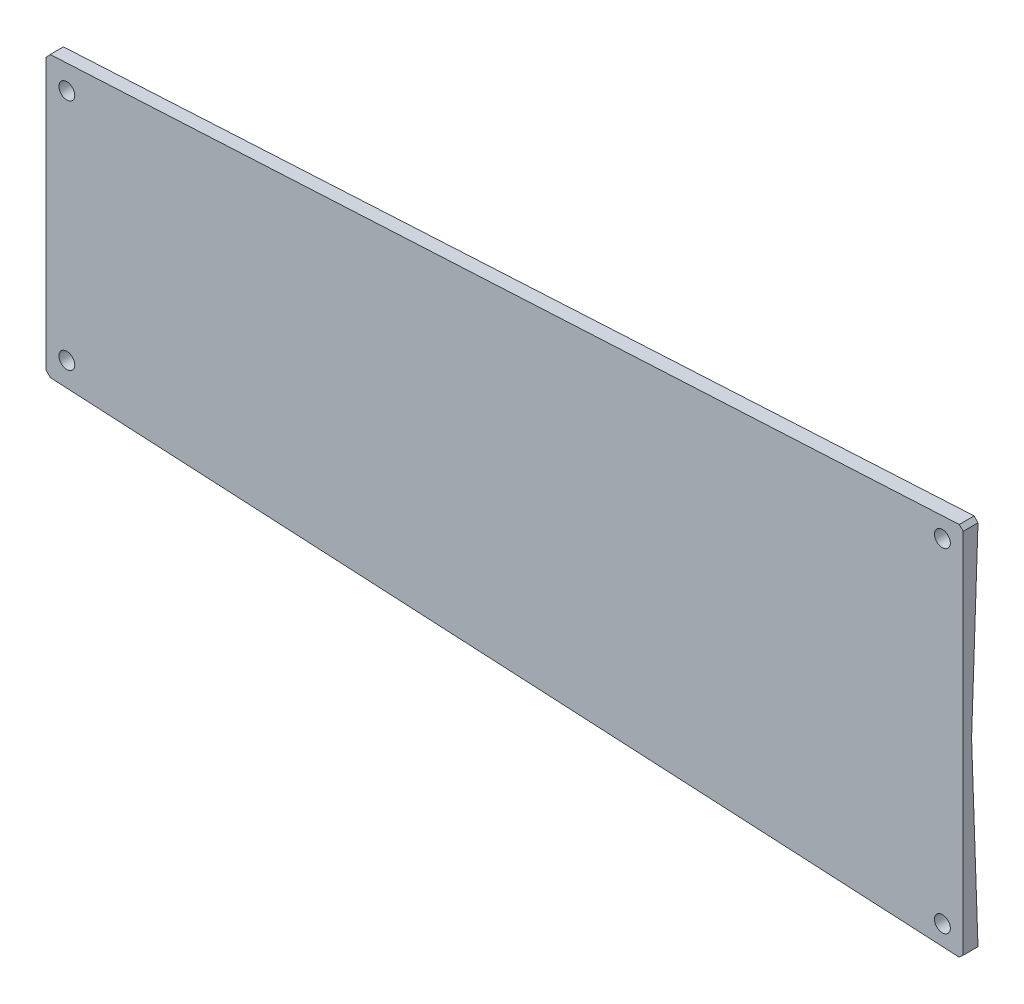
ISO-10303-21;
HEADER;
FILE_DESCRIPTION(('STEP AP214'),'2;1');
FILE_NAME('part.step','',(''),(''),'','','');
FILE_SCHEMA(('AUTOMOTIVE_DESIGN { 1 0 10303 214 1 1 1 1 }'));
ENDSEC;
DATA;
#1=APPLICATION_CONTEXT('core data for automotive mechanical design processes');
#2=APPLICATION_PROTOCOL_DEFINITION('international standard','automotive_design',2000,#1);
#3=PRODUCT_CONTEXT('',#1,'mechanical');
#4=PRODUCT('Part','Part','',(#3));
#5=PRODUCT_RELATED_PRODUCT_CATEGORY('part','',(#4));
#6=PRODUCT_DEFINITION_FORMATION('','',#4);
#7=PRODUCT_DEFINITION_CONTEXT('part definition',#1,'design');
#8=PRODUCT_DEFINITION('design','',#6,#7);
#9=PRODUCT_DEFINITION_SHAPE('','',#8);
#10=(LENGTH_UNIT() NAMED_UNIT(*) SI_UNIT(.MILLI.,.METRE.));
#11=(NAMED_UNIT(*) PLANE_ANGLE_UNIT() SI_UNIT($,.RADIAN.));
#12=(NAMED_UNIT(*) SI_UNIT($,.STERADIAN.) SOLID_ANGLE_UNIT());
#13=UNCERTAINTY_MEASURE_WITH_UNIT(LENGTH_MEASURE(1.E-05),#10,'distance_accuracy_value','');
#14=(GEOMETRIC_REPRESENTATION_CONTEXT(3) GLOBAL_UNCERTAINTY_ASSIGNED_CONTEXT((#13)) GLOBAL_UNIT_ASSIGNED_CONTEXT((#10,
#11,#12)) REPRESENTATION_CONTEXT('',''));
#15=CARTESIAN_POINT('',(0.,0.,0.));
#16=DIRECTION('',(0.,0.,1.));
#17=DIRECTION('',(1.,0.,0.));
#18=AXIS2_PLACEMENT_3D('',#15,#16,#17);
#19=CARTESIAN_POINT('',(32.8928091397849,0.,2.));
#20=DIRECTION('',(0.,0.,-1.));
#21=DIRECTION('',(-1.,0.,0.));
#22=AXIS2_PLACEMENT_3D('',#19,#20,#21);
#23=PLANE('',#22);
#24=CARTESIAN_POINT('',(-182.107190860215,28.,2.));
#25=DIRECTION('',(0.,0.,1.));
#26=DIRECTION('',(1.,0.,0.));
#27=AXIS2_PLACEMENT_3D('',#24,#25,#26);
#28=CIRCLE('',#27,1.9);
#29=CARTESIAN_POINT('',(-180.207190860215,28.,2.));
#30=VERTEX_POINT('',#29);
#31=EDGE_CURVE('E154',#30,#30,#28,.T.);
#32=ORIENTED_EDGE('',*,*,#31,.F.);
#33=EDGE_LOOP('',(#32));
#34=FACE_BOUND('',#33,.T.);
#35=DIRECTION('',(0.,1.,0.));
#36=VECTOR('',#35,1.);
#37=CARTESIAN_POINT('',(32.8928091397849,0.,2.));
#38=LINE('',#37,#36);
#39=CARTESIAN_POINT('',(32.8928091397849,-44.0483785609465,2.));
#40=VERTEX_POINT('',#39);
#41=CARTESIAN_POINT('',(32.8928091397849,44.,2.));
#42=VERTEX_POINT('',#41);
#43=EDGE_CURVE('E126',#40,#42,#38,.T.);
#44=ORIENTED_EDGE('',*,*,#43,.T.);
#45=DIRECTION('',(0.707106781186535,-0.70710678118656,0.));
#46=VECTOR('',#45,1.);
#47=CARTESIAN_POINT('',(31.9424851657029,44.9503239740821,2.));
#48=LINE('',#47,#46);
#49=CARTESIAN_POINT('',(31.9424851657029,44.9503239740821,2.));
#50=VERTEX_POINT('',#49);
#51=EDGE_CURVE('E11',#42,#50,#48,.F.);
#52=ORIENTED_EDGE('',*,*,#51,.T.);
#53=DIRECTION('',(-0.998636574463203,-0.0522014573014856,0.));
#54=VECTOR('',#53,1.);
#55=CARTESIAN_POINT('',(32.8928091397849,45.,2.));
#56=LINE('',#55,#54);
#57=CARTESIAN_POINT('',(-186.108554285752,33.5522014573015,2.));
#58=VERTEX_POINT('',#57);
#59=EDGE_CURVE('E158',#50,#58,#56,.T.);
#60=ORIENTED_EDGE('',*,*,#59,.T.);
#61=DIRECTION('',(0.669230689298131,0.74305469818954,0.));
#62=VECTOR('',#61,1.);
#63=CARTESIAN_POINT('',(-187.107190860215,32.4434035340965,2.));
#64=LINE('',#63,#62);
#65=CARTESIAN_POINT('',(-187.107190860215,32.4434035340965,2.));
#66=VERTEX_POINT('',#65);
#67=EDGE_CURVE('E175',#58,#66,#64,.F.);
#68=ORIENTED_EDGE('',*,*,#67,.T.);
#69=DIRECTION('',(0.,-1.,0.));
#70=VECTOR('',#69,1.);
#71=CARTESIAN_POINT('',(-187.107190860215,33.5,2.));
#72=LINE('',#71,#70);
#73=CARTESIAN_POINT('',(-187.107190860215,-32.5,2.));
#74=VERTEX_POINT('',#73);
#75=EDGE_CURVE('E160',#66,#74,#72,.T.);
#76=ORIENTED_EDGE('',*,*,#75,.T.);
#77=DIRECTION('',(-0.707106781186545,0.70710678118655,0.));
#78=VECTOR('',#77,1.);
#79=CARTESIAN_POINT('',(-186.052034984915,-33.5551558752998,2.));
#80=LINE('',#79,#78);
#81=CARTESIAN_POINT('',(-186.052034984915,-33.5551558752998,2.));
#82=VERTEX_POINT('',#81);
#83=EDGE_CURVE('E183',#74,#82,#80,.F.);
#84=ORIENTED_EDGE('',*,*,#83,.T.);
#85=DIRECTION('',(-0.998636574463203,0.0522014573014856,0.));
#86=VECTOR('',#85,1.);
#87=CARTESIAN_POINT('',(32.8928091397849,-45.,2.));
#88=LINE('',#87,#86);
#89=CARTESIAN_POINT('',(31.8941725653217,-44.9477985426985,2.));
#90=VERTEX_POINT('',#89);
#91=EDGE_CURVE('E115',#90,#82,#88,.T.);
#92=ORIENTED_EDGE('',*,*,#91,.F.);
#93=DIRECTION('',(-0.743054698189538,-0.669230689298133,0.));
#94=VECTOR('',#93,1.);
#95=CARTESIAN_POINT('',(32.8928091397849,-44.0483785609465,2.));
#96=LINE('',#95,#94);
#97=EDGE_CURVE('E193',#90,#40,#96,.F.);
#98=ORIENTED_EDGE('',*,*,#97,.T.);
#99=EDGE_LOOP('',(#44,#52,#60,#68,#76,#84,#92,#98));
#100=FACE_BOUND('',#99,.T.);
#101=CARTESIAN_POINT('',(27.892809139785,40.,2.));
#102=DIRECTION('',(0.,0.,1.));
#103=DIRECTION('',(1.,0.,0.));
#104=AXIS2_PLACEMENT_3D('',#101,#102,#103);
#105=CIRCLE('',#104,1.9);
#106=CARTESIAN_POINT('',(29.792809139785,40.,2.));
#107=VERTEX_POINT('',#106);
#108=EDGE_CURVE('E149',#107,#107,#105,.T.);
#109=ORIENTED_EDGE('',*,*,#108,.F.);
#110=EDGE_LOOP('',(#109));
#111=FACE_BOUND('',#110,.T.);
#112=CARTESIAN_POINT('',(-182.107190860215,-28.,2.));
#113=DIRECTION('',(0.,0.,-1.));
#114=DIRECTION('',(1.,0.,0.));
#115=AXIS2_PLACEMENT_3D('',#112,#113,#114);
#116=CIRCLE('',#115,1.9);
#117=CARTESIAN_POINT('',(-180.207190860215,-28.,2.));
#118=VERTEX_POINT('',#117);
#119=EDGE_CURVE('E134',#118,#118,#116,.T.);
#120=ORIENTED_EDGE('',*,*,#119,.T.);
#121=EDGE_LOOP('',(#120));
#122=FACE_BOUND('',#121,.T.);
#123=CARTESIAN_POINT('',(27.892809139785,-40.,2.));
#124=DIRECTION('',(0.,0.,-1.));
#125=DIRECTION('',(1.,0.,0.));
#126=AXIS2_PLACEMENT_3D('',#123,#124,#125);
#127=CIRCLE('',#126,1.9);
#128=CARTESIAN_POINT('',(29.792809139785,-40.,2.));
#129=VERTEX_POINT('',#128);
#130=EDGE_CURVE('E143',#129,#129,#127,.T.);
#131=ORIENTED_EDGE('',*,*,#130,.T.);
#132=EDGE_LOOP('',(#131));
#133=FACE_BOUND('',#132,.T.);
#134=ADVANCED_FACE('F34',(#34,#100,#111,#122,#133),#23,.F.);
#135=CARTESIAN_POINT('',(32.8928091397849,0.,0.));
#136=DIRECTION('',(0.,-0.034899496702501,-0.999390827019096));
#137=DIRECTION('',(0.,0.999390827019096,-0.034899496702501));
#138=AXIS2_PLACEMENT_3D('',#135,#136,#137);
#139=PLANE('',#138);
#140=CARTESIAN_POINT('',(-182.107190860215,28.,-0.977781545768939));
#141=DIRECTION('',(0.,-0.034899496702501,-0.999390827019096));
#142=DIRECTION('',(0.,0.999390827019096,-0.034899496702501));
#143=AXIS2_PLACEMENT_3D('',#140,#141,#142);
#144=ELLIPSE('',#143,1.90115813416776,1.9);
#145=CARTESIAN_POINT('',(-182.107190860215,29.9,-1.04413100780326));
#146=VERTEX_POINT('',#145);
#147=EDGE_CURVE('E152',#146,#146,#144,.F.);
#148=ORIENTED_EDGE('',*,*,#147,.T.);
#149=EDGE_LOOP('',(#148));
#150=FACE_BOUND('',#149,.T.);
#151=DIRECTION('',(-0.99863491522303,-0.0522013705684766,0.00182291202877508));
#152=VECTOR('',#151,1.);
#153=CARTESIAN_POINT('',(30.544093455857,44.8772262256129,-1.56714727245365));
#154=LINE('',#153,#152);
#155=CARTESIAN_POINT('',(31.9424851657029,44.9503239740821,-1.56969990207831));
#156=VERTEX_POINT('',#155);
#157=CARTESIAN_POINT('',(-186.108554285752,33.5522014573015,-1.17166869303111));
#158=VERTEX_POINT('',#157);
#159=EDGE_CURVE('E127',#156,#158,#154,.T.);
#160=ORIENTED_EDGE('',*,*,#159,.F.);
#161=DIRECTION('',(-0.706891307583151,0.706891307583177,-0.0246851884078323));
#162=VECTOR('',#161,1.);
#163=CARTESIAN_POINT('',(54.906215027373,21.9865941124111,-0.767788784908129));
#164=LINE('',#163,#162);
#165=CARTESIAN_POINT('',(32.8928091397849,44.,-1.5365138576369));
#166=VERTEX_POINT('',#165);
#167=EDGE_CURVE('E56',#156,#166,#164,.F.);
#168=ORIENTED_EDGE('',*,*,#167,.T.);
#169=DIRECTION('',(0.,0.999390827019096,-0.034899496702501));
#170=VECTOR('',#169,1.);
#171=CARTESIAN_POINT('',(32.8928091397849,0.,0.));
#172=LINE('',#171,#170);
#173=CARTESIAN_POINT('',(32.8928091397849,0.,0.));
#174=VERTEX_POINT('',#173);
#175=EDGE_CURVE('E131',#174,#166,#172,.T.);
#176=ORIENTED_EDGE('',*,*,#175,.F.);
#177=DIRECTION('',(1.,0.,0.));
#178=VECTOR('',#177,1.);
#179=CARTESIAN_POINT('',(32.8928091397849,0.,0.));
#180=LINE('',#179,#178);
#181=CARTESIAN_POINT('',(-187.107190860215,0.,0.));
#182=VERTEX_POINT('',#181);
#183=EDGE_CURVE('E110',#182,#174,#180,.T.);
#184=ORIENTED_EDGE('',*,*,#183,.F.);
#185=DIRECTION('',(0.,-0.999390827019096,0.034899496702501));
#186=VECTOR('',#185,1.);
#187=CARTESIAN_POINT('',(-187.107190860215,0.,0.));
#188=LINE('',#187,#186);
#189=CARTESIAN_POINT('',(-187.107190860215,32.4434035340964,-1.13294861634194));
#190=VERTEX_POINT('',#189);
#191=EDGE_CURVE('E120',#190,#182,#188,.T.);
#192=ORIENTED_EDGE('',*,*,#191,.F.);
#193=DIRECTION('',(-0.669005506199368,-0.742804674748946,0.0259393108243007));
#194=VECTOR('',#193,1.);
#195=CARTESIAN_POINT('',(-104.784249215167,123.847532986513,-4.32485115154364));
#196=LINE('',#195,#194);
#197=EDGE_CURVE('E170',#190,#158,#196,.F.);
#198=ORIENTED_EDGE('',*,*,#197,.T.);
#199=EDGE_LOOP('',(#160,#168,#176,#184,#192,#198));
#200=FACE_BOUND('',#199,.T.);
#201=CARTESIAN_POINT('',(27.892809139785,40.,-1.39683077966991));
#202=DIRECTION('',(0.,-0.034899496702501,-0.999390827019096));
#203=DIRECTION('',(0.,0.999390827019096,-0.034899496702501));
#204=AXIS2_PLACEMENT_3D('',#201,#202,#203);
#205=ELLIPSE('',#204,1.90115813416776,1.9);
#206=CARTESIAN_POINT('',(27.892809139785,41.9,-1.46318024170423));
#207=VERTEX_POINT('',#206);
#208=EDGE_CURVE('E153',#207,#207,#205,.F.);
#209=ORIENTED_EDGE('',*,*,#208,.T.);
#210=EDGE_LOOP('',(#209));
#211=FACE_BOUND('',#210,.T.);
#212=ADVANCED_FACE('F129',(#150,#200,#211),#139,.T.);
#213=CARTESIAN_POINT('',(32.8928091397849,0.,2.));
#214=DIRECTION('',(-1.,0.,0.));
#215=DIRECTION('',(0.,0.,1.));
#216=AXIS2_PLACEMENT_3D('',#213,#214,#215);
#217=PLANE('',#216);
#218=ORIENTED_EDGE('',*,*,#175,.T.);
#219=DIRECTION('',(0.,0.,1.));
#220=VECTOR('',#219,1.);
#221=CARTESIAN_POINT('',(32.8928091397849,44.,2.));
#222=LINE('',#221,#220);
#223=EDGE_CURVE('E42',#166,#42,#222,.T.);
#224=ORIENTED_EDGE('',*,*,#223,.T.);
#225=ORIENTED_EDGE('',*,*,#43,.F.);
#226=DIRECTION('',(0.,0.,-1.));
#227=VECTOR('',#226,1.);
#228=CARTESIAN_POINT('',(32.8928091397849,-44.0483785609465,2.));
#229=LINE('',#228,#227);
#230=CARTESIAN_POINT('',(32.8928091397849,-44.0483785609465,-1.53820327421206));
#231=VERTEX_POINT('',#230);
#232=EDGE_CURVE('E186',#40,#231,#229,.T.);
#233=ORIENTED_EDGE('',*,*,#232,.T.);
#234=DIRECTION('',(0.,-0.999390827019096,-0.034899496702501));
#235=VECTOR('',#234,1.);
#236=CARTESIAN_POINT('',(32.8928091397849,0.,0.));
#237=LINE('',#236,#235);
#238=EDGE_CURVE('E133',#174,#231,#237,.T.);
#239=ORIENTED_EDGE('',*,*,#238,.F.);
#240=EDGE_LOOP('',(#218,#224,#225,#233,#239));
#241=FACE_BOUND('',#240,.T.);
#242=ADVANCED_FACE('F221',(#241),#217,.F.);
#243=CARTESIAN_POINT('',(32.8928091397849,45.,2.));
#244=DIRECTION('',(0.0522014573014856,-0.998636574463203,0.));
#245=DIRECTION('',(0.998636574463204,0.0522014573014856,0.));
#246=AXIS2_PLACEMENT_3D('',#243,#244,#245);
#247=PLANE('',#246);
#248=ORIENTED_EDGE('',*,*,#59,.F.);
#249=DIRECTION('',(0.,0.,-1.));
#250=VECTOR('',#249,1.);
#251=CARTESIAN_POINT('',(31.9424851657029,44.9503239740821,2.));
#252=LINE('',#251,#250);
#253=EDGE_CURVE('E195',#50,#156,#252,.T.);
#254=ORIENTED_EDGE('',*,*,#253,.T.);
#255=ORIENTED_EDGE('',*,*,#159,.T.);
#256=DIRECTION('',(0.,0.,1.));
#257=VECTOR('',#256,1.);
#258=CARTESIAN_POINT('',(-186.108554285752,33.5522014573015,2.));
#259=LINE('',#258,#257);
#260=EDGE_CURVE('E172',#158,#58,#259,.T.);
#261=ORIENTED_EDGE('',*,*,#260,.T.);
#262=EDGE_LOOP('',(#248,#254,#255,#261));
#263=FACE_BOUND('',#262,.T.);
#264=ADVANCED_FACE('F201',(#263),#247,.F.);
#265=CARTESIAN_POINT('',(-187.107190860215,33.5,2.));
#266=DIRECTION('',(1.,0.,0.));
#267=DIRECTION('',(0.,0.,-1.));
#268=AXIS2_PLACEMENT_3D('',#265,#266,#267);
#269=PLANE('',#268);
#270=DIRECTION('',(0.,0.999390827019096,0.034899496702501));
#271=VECTOR('',#270,1.);
#272=CARTESIAN_POINT('',(-187.107190860215,0.,0.));
#273=LINE('',#272,#271);
#274=CARTESIAN_POINT('',(-187.107190860215,-32.5,-1.1349250084818));
#275=VERTEX_POINT('',#274);
#276=EDGE_CURVE('E104',#275,#182,#273,.T.);
#277=ORIENTED_EDGE('',*,*,#276,.F.);
#278=DIRECTION('',(0.,0.,1.));
#279=VECTOR('',#278,1.);
#280=CARTESIAN_POINT('',(-187.107190860215,-32.5,2.));
#281=LINE('',#280,#279);
#282=EDGE_CURVE('E181',#275,#74,#281,.T.);
#283=ORIENTED_EDGE('',*,*,#282,.T.);
#284=ORIENTED_EDGE('',*,*,#75,.F.);
#285=DIRECTION('',(0.,0.,-1.));
#286=VECTOR('',#285,1.);
#287=CARTESIAN_POINT('',(-187.107190860215,32.4434035340965,2.));
#288=LINE('',#287,#286);
#289=EDGE_CURVE('E124',#66,#190,#288,.T.);
#290=ORIENTED_EDGE('',*,*,#289,.T.);
#291=ORIENTED_EDGE('',*,*,#191,.T.);
#292=EDGE_LOOP('',(#277,#283,#284,#290,#291));
#293=FACE_BOUND('',#292,.T.);
#294=ADVANCED_FACE('F121',(#293),#269,.F.);
#295=CARTESIAN_POINT('',(-182.107190860215,28.,2.));
#296=DIRECTION('',(0.,0.,-1.));
#297=DIRECTION('',(-1.,0.,0.));
#298=AXIS2_PLACEMENT_3D('',#295,#296,#297);
#299=CYLINDRICAL_SURFACE('',#298,1.9);
#300=ORIENTED_EDGE('',*,*,#31,.T.);
#301=EDGE_LOOP('',(#300));
#302=FACE_BOUND('',#301,.T.);
#303=ORIENTED_EDGE('',*,*,#147,.F.);
#304=EDGE_LOOP('',(#303));
#305=FACE_BOUND('',#304,.T.);
#306=ADVANCED_FACE('F248',(#302,#305),#299,.F.);
#307=CARTESIAN_POINT('',(27.892809139785,40.,2.));
#308=DIRECTION('',(0.,0.,-1.));
#309=DIRECTION('',(-1.,0.,0.));
#310=AXIS2_PLACEMENT_3D('',#307,#308,#309);
#311=CYLINDRICAL_SURFACE('',#310,1.9);
#312=ORIENTED_EDGE('',*,*,#108,.T.);
#313=EDGE_LOOP('',(#312));
#314=FACE_BOUND('',#313,.T.);
#315=ORIENTED_EDGE('',*,*,#208,.F.);
#316=EDGE_LOOP('',(#315));
#317=FACE_BOUND('',#316,.T.);
#318=ADVANCED_FACE('F234',(#314,#317),#311,.F.);
#319=CARTESIAN_POINT('',(32.8928091397849,0.,0.));
#320=DIRECTION('',(0.,0.034899496702501,-0.999390827019096));
#321=DIRECTION('',(0.,-0.999390827019096,-0.034899496702501));
#322=AXIS2_PLACEMENT_3D('',#319,#320,#321);
#323=PLANE('',#322);
#324=CARTESIAN_POINT('',(-182.107190860215,-28.,-0.977781545768939));
#325=DIRECTION('',(0.,-0.034899496702501,0.999390827019096));
#326=DIRECTION('',(0.,-0.999390827019096,-0.034899496702501));
#327=AXIS2_PLACEMENT_3D('',#324,#325,#326);
#328=ELLIPSE('',#327,1.90115813416776,1.9);
#329=CARTESIAN_POINT('',(-182.107190860215,-29.9,-1.04413100780326));
#330=VERTEX_POINT('',#329);
#331=EDGE_CURVE('E138',#330,#330,#328,.F.);
#332=ORIENTED_EDGE('',*,*,#331,.F.);
#333=EDGE_LOOP('',(#332));
#334=FACE_BOUND('',#333,.T.);
#335=ORIENTED_EDGE('',*,*,#238,.T.);
#336=DIRECTION('',(0.742851868164299,0.669048010852075,0.0233636713658777));
#337=VECTOR('',#336,1.);
#338=CARTESIAN_POINT('',(54.8117069729089,-24.307168201524,-0.84882501776256));
#339=LINE('',#338,#337);
#340=CARTESIAN_POINT('',(31.8941725653217,-44.9477985426985,-1.56961171207109));
#341=VERTEX_POINT('',#340);
#342=EDGE_CURVE('E189',#231,#341,#339,.F.);
#343=ORIENTED_EDGE('',*,*,#342,.T.);
#344=DIRECTION('',(-0.99863491522303,0.0522013705684766,0.00182291202877508));
#345=VECTOR('',#344,1.);
#346=CARTESIAN_POINT('',(30.544093455857,-44.8772262256129,-1.56714727245365));
#347=LINE('',#346,#345);
#348=CARTESIAN_POINT('',(-186.052034984915,-33.5551558752998,-1.17177186358101));
#349=VERTEX_POINT('',#348);
#350=EDGE_CURVE('E116',#341,#349,#347,.T.);
#351=ORIENTED_EDGE('',*,*,#350,.T.);
#352=DIRECTION('',(0.706891307583161,-0.706891307583166,-0.0246851884078319));
#353=VECTOR('',#352,1.);
#354=CARTESIAN_POINT('',(-93.4341223742155,-126.173068486,-4.40606064066612));
#355=LINE('',#354,#353);
#356=EDGE_CURVE('E112',#349,#275,#355,.F.);
#357=ORIENTED_EDGE('',*,*,#356,.T.);
#358=ORIENTED_EDGE('',*,*,#276,.T.);
#359=ORIENTED_EDGE('',*,*,#183,.T.);
#360=EDGE_LOOP('',(#335,#343,#351,#357,#358,#359));
#361=FACE_BOUND('',#360,.T.);
#362=CARTESIAN_POINT('',(27.892809139785,-40.,-1.39683077966991));
#363=DIRECTION('',(0.,-0.034899496702501,0.999390827019096));
#364=DIRECTION('',(0.,-0.999390827019096,-0.034899496702501));
#365=AXIS2_PLACEMENT_3D('',#362,#363,#364);
#366=ELLIPSE('',#365,1.90115813416776,1.9);
#367=CARTESIAN_POINT('',(27.892809139785,-41.9,-1.46318024170423));
#368=VERTEX_POINT('',#367);
#369=EDGE_CURVE('E146',#368,#368,#366,.F.);
#370=ORIENTED_EDGE('',*,*,#369,.F.);
#371=EDGE_LOOP('',(#370));
#372=FACE_BOUND('',#371,.T.);
#373=ADVANCED_FACE('F107',(#334,#361,#372),#323,.T.);
#374=CARTESIAN_POINT('',(32.8928091397849,-45.,2.));
#375=DIRECTION('',(0.0522014573014856,0.998636574463203,0.));
#376=DIRECTION('',(0.998636574463204,-0.0522014573014856,0.));
#377=AXIS2_PLACEMENT_3D('',#374,#375,#376);
#378=PLANE('',#377);
#379=ORIENTED_EDGE('',*,*,#350,.F.);
#380=DIRECTION('',(0.,0.,1.));
#381=VECTOR('',#380,1.);
#382=CARTESIAN_POINT('',(31.8941725653217,-44.9477985426985,2.));
#383=LINE('',#382,#381);
#384=EDGE_CURVE('E191',#341,#90,#383,.T.);
#385=ORIENTED_EDGE('',*,*,#384,.T.);
#386=ORIENTED_EDGE('',*,*,#91,.T.);
#387=DIRECTION('',(0.,0.,-1.));
#388=VECTOR('',#387,1.);
#389=CARTESIAN_POINT('',(-186.052034984915,-33.5551558752998,2.));
#390=LINE('',#389,#388);
#391=EDGE_CURVE('E177',#82,#349,#390,.T.);
#392=ORIENTED_EDGE('',*,*,#391,.T.);
#393=EDGE_LOOP('',(#379,#385,#386,#392));
#394=FACE_BOUND('',#393,.T.);
#395=ADVANCED_FACE('F223',(#394),#378,.F.);
#396=CARTESIAN_POINT('',(-182.107190860215,-28.,2.));
#397=DIRECTION('',(0.,0.,-1.));
#398=DIRECTION('',(-1.,0.,0.));
#399=AXIS2_PLACEMENT_3D('',#396,#397,#398);
#400=CYLINDRICAL_SURFACE('',#399,1.9);
#401=ORIENTED_EDGE('',*,*,#119,.F.);
#402=EDGE_LOOP('',(#401));
#403=FACE_BOUND('',#402,.T.);
#404=ORIENTED_EDGE('',*,*,#331,.T.);
#405=EDGE_LOOP('',(#404));
#406=FACE_BOUND('',#405,.T.);
#407=ADVANCED_FACE('F225',(#403,#406),#400,.F.);
#408=CARTESIAN_POINT('',(27.892809139785,-40.,2.));
#409=DIRECTION('',(0.,0.,-1.));
#410=DIRECTION('',(-1.,0.,0.));
#411=AXIS2_PLACEMENT_3D('',#408,#409,#410);
#412=CYLINDRICAL_SURFACE('',#411,1.9);
#413=ORIENTED_EDGE('',*,*,#130,.F.);
#414=EDGE_LOOP('',(#413));
#415=FACE_BOUND('',#414,.T.);
#416=ORIENTED_EDGE('',*,*,#369,.T.);
#417=EDGE_LOOP('',(#416));
#418=FACE_BOUND('',#417,.T.);
#419=ADVANCED_FACE('F231',(#415,#418),#412,.F.);
#420=CARTESIAN_POINT('',(-187.107190860215,32.4434035340965,2.));
#421=DIRECTION('',(0.74305469818954,-0.669230689298131,0.));
#422=DIRECTION('',(0.669230689298131,0.74305469818954,0.));
#423=AXIS2_PLACEMENT_3D('',#420,#421,#422);
#424=PLANE('',#423);
#425=ORIENTED_EDGE('',*,*,#67,.F.);
#426=ORIENTED_EDGE('',*,*,#260,.F.);
#427=ORIENTED_EDGE('',*,*,#197,.F.);
#428=ORIENTED_EDGE('',*,*,#289,.F.);
#429=EDGE_LOOP('',(#425,#426,#427,#428));
#430=FACE_BOUND('',#429,.T.);
#431=ADVANCED_FACE('F207',(#430),#424,.F.);
#432=CARTESIAN_POINT('',(-186.052034984915,-33.5551558752998,2.));
#433=DIRECTION('',(0.70710678118655,0.707106781186545,0.));
#434=DIRECTION('',(-0.707106781186545,0.70710678118655,0.));
#435=AXIS2_PLACEMENT_3D('',#432,#433,#434);
#436=PLANE('',#435);
#437=ORIENTED_EDGE('',*,*,#83,.F.);
#438=ORIENTED_EDGE('',*,*,#282,.F.);
#439=ORIENTED_EDGE('',*,*,#356,.F.);
#440=ORIENTED_EDGE('',*,*,#391,.F.);
#441=EDGE_LOOP('',(#437,#438,#439,#440));
#442=FACE_BOUND('',#441,.T.);
#443=ADVANCED_FACE('F212',(#442),#436,.F.);
#444=CARTESIAN_POINT('',(32.8928091397849,-44.0483785609465,2.));
#445=DIRECTION('',(-0.669230689298133,0.743054698189538,0.));
#446=DIRECTION('',(-0.743054698189538,-0.669230689298133,0.));
#447=AXIS2_PLACEMENT_3D('',#444,#445,#446);
#448=PLANE('',#447);
#449=ORIENTED_EDGE('',*,*,#97,.F.);
#450=ORIENTED_EDGE('',*,*,#384,.F.);
#451=ORIENTED_EDGE('',*,*,#342,.F.);
#452=ORIENTED_EDGE('',*,*,#232,.F.);
#453=EDGE_LOOP('',(#449,#450,#451,#452));
#454=FACE_BOUND('',#453,.T.);
#455=ADVANCED_FACE('F220',(#454),#448,.F.);
#456=CARTESIAN_POINT('',(31.9424851657029,44.9503239740821,2.));
#457=DIRECTION('',(-0.70710678118656,-0.707106781186535,0.));
#458=DIRECTION('',(0.707106781186535,-0.70710678118656,0.));
#459=AXIS2_PLACEMENT_3D('',#456,#457,#458);
#460=PLANE('',#459);
#461=ORIENTED_EDGE('',*,*,#51,.F.);
#462=ORIENTED_EDGE('',*,*,#223,.F.);
#463=ORIENTED_EDGE('',*,*,#167,.F.);
#464=ORIENTED_EDGE('',*,*,#253,.F.);
#465=EDGE_LOOP('',(#461,#462,#463,#464));
#466=FACE_BOUND('',#465,.T.);
#467=ADVANCED_FACE('F36',(#466),#460,.F.);
#468=CLOSED_SHELL('',(#134,#212,#242,#264,#294,#306,#318,#373,#395,#407,#419,#431,#443,#455,#467));
#469=MANIFOLD_SOLID_BREP('B2',#468);
#470=ADVANCED_BREP_SHAPE_REPRESENTATION('',(#18,#469),#14);
#471=SHAPE_DEFINITION_REPRESENTATION(#9,#470);
ENDSEC;
END-ISO-10303-21;
